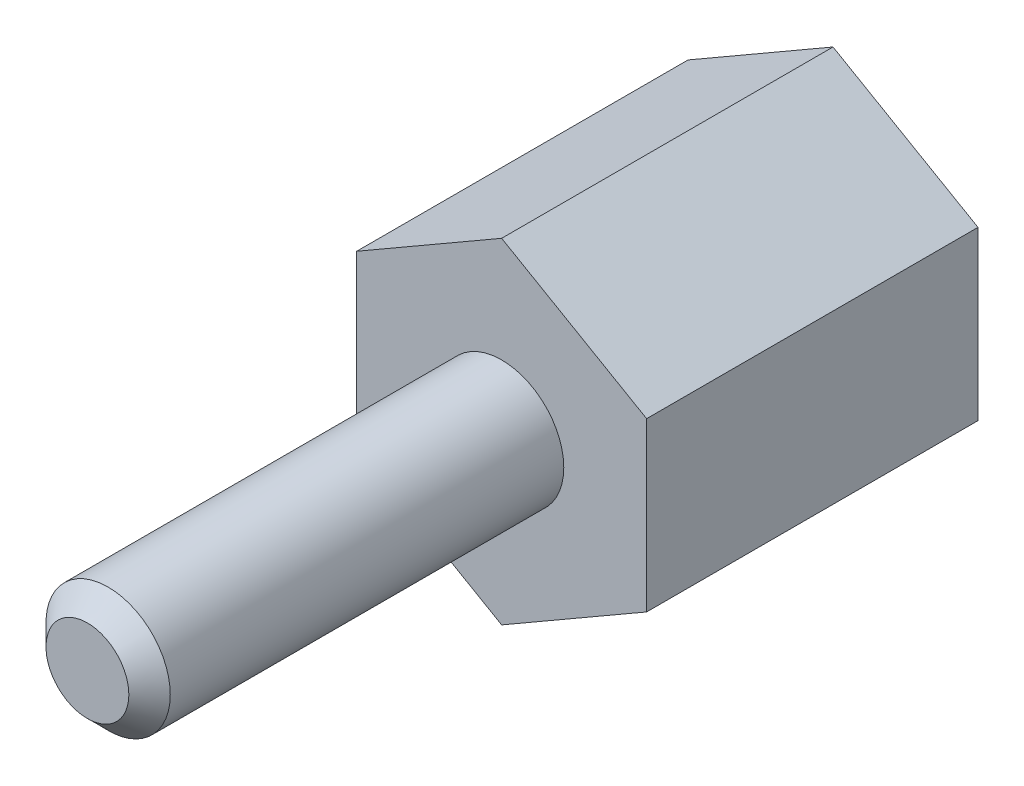
ISO-10303-21;
HEADER;
FILE_DESCRIPTION(('STEP AP214'),'2;1');
FILE_NAME('part.step','',(''),(''),'','','');
FILE_SCHEMA(('AUTOMOTIVE_DESIGN { 1 0 10303 214 1 1 1 1 }'));
ENDSEC;
DATA;
#1=APPLICATION_CONTEXT('core data for automotive mechanical design processes');
#2=APPLICATION_PROTOCOL_DEFINITION('international standard','automotive_design',2000,#1);
#3=PRODUCT_CONTEXT('',#1,'mechanical');
#4=PRODUCT('Part','Part','',(#3));
#5=PRODUCT_RELATED_PRODUCT_CATEGORY('part','',(#4));
#6=PRODUCT_DEFINITION_FORMATION('','',#4);
#7=PRODUCT_DEFINITION_CONTEXT('part definition',#1,'design');
#8=PRODUCT_DEFINITION('design','',#6,#7);
#9=PRODUCT_DEFINITION_SHAPE('','',#8);
#10=(LENGTH_UNIT() NAMED_UNIT(*) SI_UNIT(.MILLI.,.METRE.));
#11=(NAMED_UNIT(*) PLANE_ANGLE_UNIT() SI_UNIT($,.RADIAN.));
#12=(NAMED_UNIT(*) SI_UNIT($,.STERADIAN.) SOLID_ANGLE_UNIT());
#13=UNCERTAINTY_MEASURE_WITH_UNIT(LENGTH_MEASURE(1.E-05),#10,'distance_accuracy_value','');
#14=(GEOMETRIC_REPRESENTATION_CONTEXT(3) GLOBAL_UNCERTAINTY_ASSIGNED_CONTEXT((#13)) GLOBAL_UNIT_ASSIGNED_CONTEXT((#10,
#11,#12)) REPRESENTATION_CONTEXT('',''));
#15=CARTESIAN_POINT('',(0.,0.,0.));
#16=DIRECTION('',(0.,0.,1.));
#17=DIRECTION('',(1.,0.,0.));
#18=AXIS2_PLACEMENT_3D('',#15,#16,#17);
#19=CARTESIAN_POINT('',(0.,4.04145188432737,8.));
#20=DIRECTION('',(0.,0.,1.));
#21=DIRECTION('',(1.,0.,0.));
#22=AXIS2_PLACEMENT_3D('',#19,#20,#21);
#23=PLANE('',#22);
#24=DIRECTION('',(-0.866025403784438,0.5,0.));
#25=VECTOR('',#24,1.);
#26=CARTESIAN_POINT('',(3.5,2.02072594216368,8.));
#27=LINE('',#26,#25);
#28=CARTESIAN_POINT('',(3.5,2.02072594216368,8.));
#29=VERTEX_POINT('',#28);
#30=CARTESIAN_POINT('',(0.,4.04145188432737,8.));
#31=VERTEX_POINT('',#30);
#32=EDGE_CURVE('E117',#29,#31,#27,.T.);
#33=ORIENTED_EDGE('',*,*,#32,.T.);
#34=DIRECTION('',(-0.866025403784439,-0.5,0.));
#35=VECTOR('',#34,1.);
#36=CARTESIAN_POINT('',(0.,4.04145188432737,8.));
#37=LINE('',#36,#35);
#38=CARTESIAN_POINT('',(-3.5,2.02072594216369,8.));
#39=VERTEX_POINT('',#38);
#40=EDGE_CURVE('E119',#31,#39,#37,.T.);
#41=ORIENTED_EDGE('',*,*,#40,.T.);
#42=DIRECTION('',(0.,-1.,0.));
#43=VECTOR('',#42,1.);
#44=CARTESIAN_POINT('',(-3.5,2.02072594216369,8.));
#45=LINE('',#44,#43);
#46=CARTESIAN_POINT('',(-3.5,-2.02072594216369,8.));
#47=VERTEX_POINT('',#46);
#48=EDGE_CURVE('E121',#39,#47,#45,.T.);
#49=ORIENTED_EDGE('',*,*,#48,.T.);
#50=DIRECTION('',(0.866025403784439,-0.499999999999999,0.));
#51=VECTOR('',#50,1.);
#52=CARTESIAN_POINT('',(-3.5,-2.02072594216369,8.));
#53=LINE('',#52,#51);
#54=CARTESIAN_POINT('',(0.,-4.04145188432738,8.));
#55=VERTEX_POINT('',#54);
#56=EDGE_CURVE('E123',#47,#55,#53,.T.);
#57=ORIENTED_EDGE('',*,*,#56,.T.);
#58=DIRECTION('',(0.866025403784439,0.499999999999999,0.));
#59=VECTOR('',#58,1.);
#60=CARTESIAN_POINT('',(0.,-4.04145188432738,8.));
#61=LINE('',#60,#59);
#62=CARTESIAN_POINT('',(3.5,-2.02072594216369,8.));
#63=VERTEX_POINT('',#62);
#64=EDGE_CURVE('E49',#55,#63,#61,.T.);
#65=ORIENTED_EDGE('',*,*,#64,.T.);
#66=DIRECTION('',(0.,1.,0.));
#67=VECTOR('',#66,1.);
#68=CARTESIAN_POINT('',(3.5,-2.02072594216369,8.));
#69=LINE('',#68,#67);
#70=EDGE_CURVE('E44',#63,#29,#69,.T.);
#71=ORIENTED_EDGE('',*,*,#70,.T.);
#72=EDGE_LOOP('',(#33,#41,#49,#57,#65,#71));
#73=FACE_BOUND('',#72,.T.);
#74=CARTESIAN_POINT('',(0.,0.,8.));
#75=DIRECTION('',(0.,0.,1.));
#76=DIRECTION('',(1.,0.,0.));
#77=AXIS2_PLACEMENT_3D('',#74,#75,#76);
#78=CIRCLE('',#77,1.5);
#79=CARTESIAN_POINT('',(1.5,0.,8.));
#80=VERTEX_POINT('',#79);
#81=EDGE_CURVE('E101',#80,#80,#78,.T.);
#82=ORIENTED_EDGE('',*,*,#81,.F.);
#83=EDGE_LOOP('',(#82));
#84=FACE_BOUND('',#83,.T.);
#85=ADVANCED_FACE('F29',(#73,#84),#23,.T.);
#86=CARTESIAN_POINT('',(3.5,2.02072594216368,8.));
#87=DIRECTION('',(-0.5,-0.866025403784439,0.));
#88=DIRECTION('',(0.866025403784439,-0.5,0.));
#89=AXIS2_PLACEMENT_3D('',#86,#87,#88);
#90=PLANE('',#89);
#91=DIRECTION('',(-0.866025403784438,0.5,0.));
#92=VECTOR('',#91,1.);
#93=CARTESIAN_POINT('',(3.5,2.02072594216368,0.));
#94=LINE('',#93,#92);
#95=CARTESIAN_POINT('',(3.5,2.02072594216368,0.));
#96=VERTEX_POINT('',#95);
#97=CARTESIAN_POINT('',(0.,4.04145188432737,0.));
#98=VERTEX_POINT('',#97);
#99=EDGE_CURVE('E104',#96,#98,#94,.T.);
#100=ORIENTED_EDGE('',*,*,#99,.T.);
#101=DIRECTION('',(0.,0.,-1.));
#102=VECTOR('',#101,1.);
#103=CARTESIAN_POINT('',(0.,4.04145188432737,8.));
#104=LINE('',#103,#102);
#105=EDGE_CURVE('E142',#31,#98,#104,.T.);
#106=ORIENTED_EDGE('',*,*,#105,.F.);
#107=ORIENTED_EDGE('',*,*,#32,.F.);
#108=DIRECTION('',(0.,0.,-1.));
#109=VECTOR('',#108,1.);
#110=CARTESIAN_POINT('',(3.5,2.02072594216368,8.));
#111=LINE('',#110,#109);
#112=EDGE_CURVE('E127',#29,#96,#111,.T.);
#113=ORIENTED_EDGE('',*,*,#112,.T.);
#114=EDGE_LOOP('',(#100,#106,#107,#113));
#115=FACE_BOUND('',#114,.T.);
#116=ADVANCED_FACE('F31',(#115),#90,.F.);
#117=CARTESIAN_POINT('',(0.,4.04145188432737,8.));
#118=DIRECTION('',(0.5,-0.866025403784439,0.));
#119=DIRECTION('',(0.866025403784439,0.5,0.));
#120=AXIS2_PLACEMENT_3D('',#117,#118,#119);
#121=PLANE('',#120);
#122=DIRECTION('',(-0.866025403784439,-0.5,0.));
#123=VECTOR('',#122,1.);
#124=CARTESIAN_POINT('',(0.,4.04145188432737,0.));
#125=LINE('',#124,#123);
#126=CARTESIAN_POINT('',(-3.5,2.02072594216369,0.));
#127=VERTEX_POINT('',#126);
#128=EDGE_CURVE('E107',#98,#127,#125,.T.);
#129=ORIENTED_EDGE('',*,*,#128,.T.);
#130=DIRECTION('',(0.,0.,-1.));
#131=VECTOR('',#130,1.);
#132=CARTESIAN_POINT('',(-3.5,2.02072594216369,8.));
#133=LINE('',#132,#131);
#134=EDGE_CURVE('E139',#39,#127,#133,.T.);
#135=ORIENTED_EDGE('',*,*,#134,.F.);
#136=ORIENTED_EDGE('',*,*,#40,.F.);
#137=ORIENTED_EDGE('',*,*,#105,.T.);
#138=EDGE_LOOP('',(#129,#135,#136,#137));
#139=FACE_BOUND('',#138,.T.);
#140=ADVANCED_FACE('F160',(#139),#121,.F.);
#141=CARTESIAN_POINT('',(-3.5,2.02072594216369,8.));
#142=DIRECTION('',(1.,0.,0.));
#143=DIRECTION('',(0.,1.,0.));
#144=AXIS2_PLACEMENT_3D('',#141,#142,#143);
#145=PLANE('',#144);
#146=DIRECTION('',(0.,-1.,0.));
#147=VECTOR('',#146,1.);
#148=CARTESIAN_POINT('',(-3.5,2.02072594216369,0.));
#149=LINE('',#148,#147);
#150=CARTESIAN_POINT('',(-3.5,-2.02072594216369,0.));
#151=VERTEX_POINT('',#150);
#152=EDGE_CURVE('E109',#127,#151,#149,.T.);
#153=ORIENTED_EDGE('',*,*,#152,.T.);
#154=DIRECTION('',(0.,0.,-1.));
#155=VECTOR('',#154,1.);
#156=CARTESIAN_POINT('',(-3.5,-2.02072594216369,8.));
#157=LINE('',#156,#155);
#158=EDGE_CURVE('E136',#47,#151,#157,.T.);
#159=ORIENTED_EDGE('',*,*,#158,.F.);
#160=ORIENTED_EDGE('',*,*,#48,.F.);
#161=ORIENTED_EDGE('',*,*,#134,.T.);
#162=EDGE_LOOP('',(#153,#159,#160,#161));
#163=FACE_BOUND('',#162,.T.);
#164=ADVANCED_FACE('F178',(#163),#145,.F.);
#165=CARTESIAN_POINT('',(-3.5,-2.02072594216369,8.));
#166=DIRECTION('',(0.5,0.866025403784439,0.));
#167=DIRECTION('',(-0.866025403784439,0.5,0.));
#168=AXIS2_PLACEMENT_3D('',#165,#166,#167);
#169=PLANE('',#168);
#170=DIRECTION('',(0.866025403784439,-0.499999999999999,0.));
#171=VECTOR('',#170,1.);
#172=CARTESIAN_POINT('',(-3.5,-2.02072594216369,0.));
#173=LINE('',#172,#171);
#174=CARTESIAN_POINT('',(0.,-4.04145188432738,0.));
#175=VERTEX_POINT('',#174);
#176=EDGE_CURVE('E111',#151,#175,#173,.T.);
#177=ORIENTED_EDGE('',*,*,#176,.T.);
#178=DIRECTION('',(0.,0.,-1.));
#179=VECTOR('',#178,1.);
#180=CARTESIAN_POINT('',(0.,-4.04145188432738,8.));
#181=LINE('',#180,#179);
#182=EDGE_CURVE('E133',#55,#175,#181,.T.);
#183=ORIENTED_EDGE('',*,*,#182,.F.);
#184=ORIENTED_EDGE('',*,*,#56,.F.);
#185=ORIENTED_EDGE('',*,*,#158,.T.);
#186=EDGE_LOOP('',(#177,#183,#184,#185));
#187=FACE_BOUND('',#186,.T.);
#188=ADVANCED_FACE('F174',(#187),#169,.F.);
#189=CARTESIAN_POINT('',(0.,-4.04145188432738,8.));
#190=DIRECTION('',(-0.499999999999999,0.866025403784439,0.));
#191=DIRECTION('',(-0.866025403784439,-0.499999999999999,0.));
#192=AXIS2_PLACEMENT_3D('',#189,#190,#191);
#193=PLANE('',#192);
#194=DIRECTION('',(0.866025403784439,0.499999999999999,0.));
#195=VECTOR('',#194,1.);
#196=CARTESIAN_POINT('',(0.,-4.04145188432738,0.));
#197=LINE('',#196,#195);
#198=CARTESIAN_POINT('',(3.5,-2.02072594216369,0.));
#199=VERTEX_POINT('',#198);
#200=EDGE_CURVE('E113',#175,#199,#197,.T.);
#201=ORIENTED_EDGE('',*,*,#200,.T.);
#202=DIRECTION('',(0.,0.,-1.));
#203=VECTOR('',#202,1.);
#204=CARTESIAN_POINT('',(3.5,-2.02072594216369,8.));
#205=LINE('',#204,#203);
#206=EDGE_CURVE('E130',#63,#199,#205,.T.);
#207=ORIENTED_EDGE('',*,*,#206,.F.);
#208=ORIENTED_EDGE('',*,*,#64,.F.);
#209=ORIENTED_EDGE('',*,*,#182,.T.);
#210=EDGE_LOOP('',(#201,#207,#208,#209));
#211=FACE_BOUND('',#210,.T.);
#212=ADVANCED_FACE('F170',(#211),#193,.F.);
#213=CARTESIAN_POINT('',(3.5,-2.02072594216369,8.));
#214=DIRECTION('',(-1.,0.,0.));
#215=DIRECTION('',(0.,-1.,0.));
#216=AXIS2_PLACEMENT_3D('',#213,#214,#215);
#217=PLANE('',#216);
#218=DIRECTION('',(0.,1.,0.));
#219=VECTOR('',#218,1.);
#220=CARTESIAN_POINT('',(3.5,-2.02072594216369,0.));
#221=LINE('',#220,#219);
#222=EDGE_CURVE('E115',#199,#96,#221,.T.);
#223=ORIENTED_EDGE('',*,*,#222,.T.);
#224=ORIENTED_EDGE('',*,*,#112,.F.);
#225=ORIENTED_EDGE('',*,*,#70,.F.);
#226=ORIENTED_EDGE('',*,*,#206,.T.);
#227=EDGE_LOOP('',(#223,#224,#225,#226));
#228=FACE_BOUND('',#227,.T.);
#229=ADVANCED_FACE('F167',(#228),#217,.F.);
#230=CARTESIAN_POINT('',(0.,4.04145188432737,0.));
#231=DIRECTION('',(0.,0.,1.));
#232=DIRECTION('',(1.,0.,0.));
#233=AXIS2_PLACEMENT_3D('',#230,#231,#232);
#234=PLANE('',#233);
#235=CARTESIAN_POINT('',(0.,0.,0.));
#236=DIRECTION('',(0.,0.,-1.));
#237=DIRECTION('',(-1.,0.,0.));
#238=AXIS2_PLACEMENT_3D('',#235,#236,#237);
#239=CIRCLE('',#238,1.5);
#240=CARTESIAN_POINT('',(-1.5,0.,0.));
#241=VERTEX_POINT('',#240);
#242=EDGE_CURVE('E96',#241,#241,#239,.T.);
#243=ORIENTED_EDGE('',*,*,#242,.F.);
#244=EDGE_LOOP('',(#243));
#245=FACE_BOUND('',#244,.T.);
#246=ORIENTED_EDGE('',*,*,#99,.F.);
#247=ORIENTED_EDGE('',*,*,#222,.F.);
#248=ORIENTED_EDGE('',*,*,#200,.F.);
#249=ORIENTED_EDGE('',*,*,#176,.F.);
#250=ORIENTED_EDGE('',*,*,#152,.F.);
#251=ORIENTED_EDGE('',*,*,#128,.F.);
#252=EDGE_LOOP('',(#246,#247,#248,#249,#250,#251));
#253=FACE_BOUND('',#252,.T.);
#254=ADVANCED_FACE('F165',(#245,#253),#234,.F.);
#255=CARTESIAN_POINT('',(0.,0.,18.));
#256=DIRECTION('',(0.,0.,-1.));
#257=DIRECTION('',(-1.,0.,0.));
#258=AXIS2_PLACEMENT_3D('',#255,#256,#257);
#259=CYLINDRICAL_SURFACE('',#258,1.5);
#260=CARTESIAN_POINT('',(0.,0.,17.5));
#261=DIRECTION('',(0.,0.,1.));
#262=DIRECTION('',(1.,0.,0.));
#263=AXIS2_PLACEMENT_3D('',#260,#261,#262);
#264=CIRCLE('',#263,1.5);
#265=CARTESIAN_POINT('',(1.5,0.,17.5));
#266=VERTEX_POINT('',#265);
#267=EDGE_CURVE('E11',#266,#266,#264,.F.);
#268=ORIENTED_EDGE('',*,*,#267,.T.);
#269=EDGE_LOOP('',(#268));
#270=FACE_BOUND('',#269,.T.);
#271=ORIENTED_EDGE('',*,*,#81,.T.);
#272=EDGE_LOOP('',(#271));
#273=FACE_BOUND('',#272,.T.);
#274=ADVANCED_FACE('F200',(#270,#273),#259,.T.);
#275=CARTESIAN_POINT('',(0.,0.,18.));
#276=DIRECTION('',(0.,0.,1.));
#277=DIRECTION('',(1.,0.,0.));
#278=AXIS2_PLACEMENT_3D('',#275,#276,#277);
#279=PLANE('',#278);
#280=CARTESIAN_POINT('',(0.,0.,18.));
#281=DIRECTION('',(0.,0.,1.));
#282=DIRECTION('',(1.,0.,0.));
#283=AXIS2_PLACEMENT_3D('',#280,#281,#282);
#284=CIRCLE('',#283,0.999999999999999);
#285=CARTESIAN_POINT('',(0.999999999999999,0.,18.));
#286=VERTEX_POINT('',#285);
#287=EDGE_CURVE('E37',#286,#286,#284,.T.);
#288=ORIENTED_EDGE('',*,*,#287,.T.);
#289=EDGE_LOOP('',(#288));
#290=FACE_BOUND('',#289,.T.);
#291=ADVANCED_FACE('F147',(#290),#279,.T.);
#292=CARTESIAN_POINT('',(0.,0.,0.));
#293=DIRECTION('',(0.,0.,-1.));
#294=DIRECTION('',(-1.,0.,0.));
#295=AXIS2_PLACEMENT_3D('',#292,#293,#294);
#296=CONICAL_SURFACE('',#295,1.5,0.785398163397443);
#297=CARTESIAN_POINT('',(0.,0.,0.250000000000002));
#298=DIRECTION('',(0.,0.,-1.));
#299=DIRECTION('',(-1.,0.,0.));
#300=AXIS2_PLACEMENT_3D('',#297,#298,#299);
#301=CIRCLE('',#300,1.25);
#302=CARTESIAN_POINT('',(-1.25,0.,0.250000000000002));
#303=VERTEX_POINT('',#302);
#304=EDGE_CURVE('E93',#303,#303,#301,.T.);
#305=ORIENTED_EDGE('',*,*,#304,.F.);
#306=EDGE_LOOP('',(#305));
#307=FACE_BOUND('',#306,.T.);
#308=ORIENTED_EDGE('',*,*,#242,.T.);
#309=EDGE_LOOP('',(#308));
#310=FACE_BOUND('',#309,.T.);
#311=ADVANCED_FACE('F208',(#307,#310),#296,.F.);
#312=CARTESIAN_POINT('',(0.,0.,0.));
#313=DIRECTION('',(0.,0.,-1.));
#314=DIRECTION('',(-1.,0.,0.));
#315=AXIS2_PLACEMENT_3D('',#312,#313,#314);
#316=CYLINDRICAL_SURFACE('',#315,1.25);
#317=CARTESIAN_POINT('',(0.,0.,6.));
#318=DIRECTION('',(0.,0.,-1.));
#319=DIRECTION('',(-1.,0.,0.));
#320=AXIS2_PLACEMENT_3D('',#317,#318,#319);
#321=CIRCLE('',#320,1.25);
#322=CARTESIAN_POINT('',(-1.25,0.,6.));
#323=VERTEX_POINT('',#322);
#324=EDGE_CURVE('E91',#323,#323,#321,.T.);
#325=ORIENTED_EDGE('',*,*,#324,.F.);
#326=EDGE_LOOP('',(#325));
#327=FACE_BOUND('',#326,.T.);
#328=ORIENTED_EDGE('',*,*,#304,.T.);
#329=EDGE_LOOP('',(#328));
#330=FACE_BOUND('',#329,.T.);
#331=ADVANCED_FACE('F87',(#327,#330),#316,.F.);
#332=CARTESIAN_POINT('',(0.,0.,6.));
#333=DIRECTION('',(0.,0.,-1.));
#334=DIRECTION('',(-1.,0.,0.));
#335=AXIS2_PLACEMENT_3D('',#332,#333,#334);
#336=CONICAL_SURFACE('',#335,1.25,1.02974425867665);
#337=CARTESIAN_POINT('',(0.,0.,6.75107577378445));
#338=VERTEX_POINT('',#337);
#339=VERTEX_LOOP('',#338);
#340=FACE_BOUND('',#339,.T.);
#341=ORIENTED_EDGE('',*,*,#324,.T.);
#342=EDGE_LOOP('',(#341));
#343=FACE_BOUND('',#342,.T.);
#344=ADVANCED_FACE('F83',(#340,#343),#336,.F.);
#345=CARTESIAN_POINT('',(0.,0.,18.));
#346=DIRECTION('',(0.,0.,-1.));
#347=DIRECTION('',(-1.,0.,0.));
#348=AXIS2_PLACEMENT_3D('',#345,#346,#347);
#349=CONICAL_SURFACE('',#348,0.999999999999999,0.785398163397449);
#350=ORIENTED_EDGE('',*,*,#267,.F.);
#351=EDGE_LOOP('',(#350));
#352=FACE_BOUND('',#351,.T.);
#353=ORIENTED_EDGE('',*,*,#287,.F.);
#354=EDGE_LOOP('',(#353));
#355=FACE_BOUND('',#354,.T.);
#356=ADVANCED_FACE('F86',(#352,#355),#349,.T.);
#357=CLOSED_SHELL('',(#85,#116,#140,#164,#188,#212,#229,#254,#274,#291,#311,#331,#344,#356));
#358=MANIFOLD_SOLID_BREP('B2',#357);
#359=ADVANCED_BREP_SHAPE_REPRESENTATION('',(#18,#358),#14);
#360=SHAPE_DEFINITION_REPRESENTATION(#9,#359);
ENDSEC;
END-ISO-10303-21;
